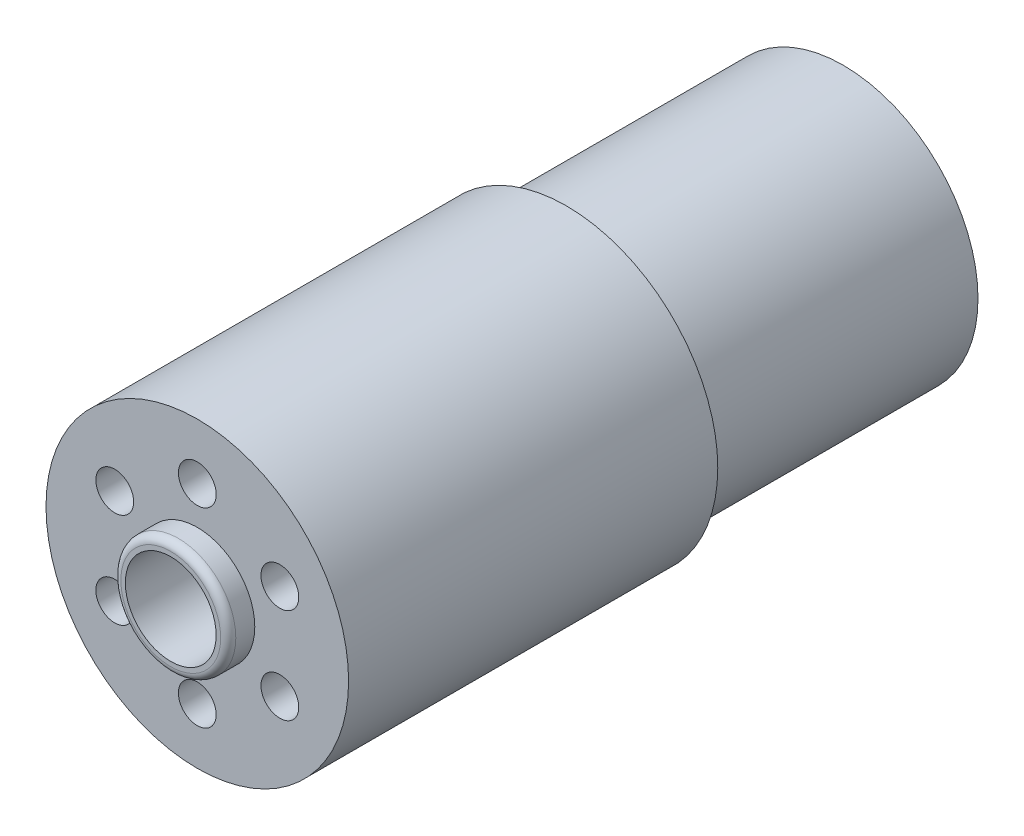
ISO-10303-21;
HEADER;
FILE_DESCRIPTION(('STEP AP214'),'2;1');
FILE_NAME('part.step','',(''),(''),'','','');
FILE_SCHEMA(('AUTOMOTIVE_DESIGN { 1 0 10303 214 1 1 1 1 }'));
ENDSEC;
DATA;
#1=APPLICATION_CONTEXT('core data for automotive mechanical design processes');
#2=APPLICATION_PROTOCOL_DEFINITION('international standard','automotive_design',2000,#1);
#3=PRODUCT_CONTEXT('',#1,'mechanical');
#4=PRODUCT('Part','Part','',(#3));
#5=PRODUCT_RELATED_PRODUCT_CATEGORY('part','',(#4));
#6=PRODUCT_DEFINITION_FORMATION('','',#4);
#7=PRODUCT_DEFINITION_CONTEXT('part definition',#1,'design');
#8=PRODUCT_DEFINITION('design','',#6,#7);
#9=PRODUCT_DEFINITION_SHAPE('','',#8);
#10=(LENGTH_UNIT() NAMED_UNIT(*) SI_UNIT(.MILLI.,.METRE.));
#11=(NAMED_UNIT(*) PLANE_ANGLE_UNIT() SI_UNIT($,.RADIAN.));
#12=(NAMED_UNIT(*) SI_UNIT($,.STERADIAN.) SOLID_ANGLE_UNIT());
#13=UNCERTAINTY_MEASURE_WITH_UNIT(LENGTH_MEASURE(1.E-05),#10,'distance_accuracy_value','');
#14=(GEOMETRIC_REPRESENTATION_CONTEXT(3) GLOBAL_UNCERTAINTY_ASSIGNED_CONTEXT((#13)) GLOBAL_UNIT_ASSIGNED_CONTEXT((#10,
#11,#12)) REPRESENTATION_CONTEXT('',''));
#15=CARTESIAN_POINT('',(0.,0.,0.));
#16=DIRECTION('',(0.,0.,1.));
#17=DIRECTION('',(1.,0.,0.));
#18=AXIS2_PLACEMENT_3D('',#15,#16,#17);
#19=CARTESIAN_POINT('',(0.,0.,0.));
#20=DIRECTION('',(0.,0.,1.));
#21=DIRECTION('',(1.,0.,0.));
#22=AXIS2_PLACEMENT_3D('',#19,#20,#21);
#23=PLANE('',#22);
#24=CARTESIAN_POINT('',(0.,0.,0.));
#25=DIRECTION('',(0.,0.,-1.));
#26=DIRECTION('',(-1.,0.,0.));
#27=AXIS2_PLACEMENT_3D('',#24,#25,#26);
#28=CIRCLE('',#27,22.606);
#29=CARTESIAN_POINT('',(-22.606,0.,0.));
#30=VERTEX_POINT('',#29);
#31=EDGE_CURVE('E128',#30,#30,#28,.T.);
#32=ORIENTED_EDGE('',*,*,#31,.T.);
#33=EDGE_LOOP('',(#32));
#34=FACE_BOUND('',#33,.T.);
#35=CARTESIAN_POINT('',(13.8581385113308,8.00100000004812,0.));
#36=DIRECTION('',(0.,0.,-1.));
#37=DIRECTION('',(-1.,0.,0.));
#38=AXIS2_PLACEMENT_3D('',#35,#36,#37);
#39=CIRCLE('',#38,3.175);
#40=CARTESIAN_POINT('',(10.6831385113308,8.00100000004812,0.));
#41=VERTEX_POINT('',#40);
#42=EDGE_CURVE('E75',#41,#41,#39,.T.);
#43=ORIENTED_EDGE('',*,*,#42,.F.);
#44=EDGE_LOOP('',(#43));
#45=FACE_BOUND('',#44,.T.);
#46=CARTESIAN_POINT('',(-5.55527845946813E-11,16.002,0.));
#47=DIRECTION('',(0.,0.,-1.));
#48=DIRECTION('',(-1.,0.,0.));
#49=AXIS2_PLACEMENT_3D('',#46,#47,#48);
#50=CIRCLE('',#49,3.175);
#51=CARTESIAN_POINT('',(-3.17500000005555,16.002,0.));
#52=VERTEX_POINT('',#51);
#53=EDGE_CURVE('E97',#52,#52,#50,.T.);
#54=ORIENTED_EDGE('',*,*,#53,.F.);
#55=EDGE_LOOP('',(#54));
#56=FACE_BOUND('',#55,.T.);
#57=CARTESIAN_POINT('',(-13.8581385113864,8.00099999995189,0.));
#58=DIRECTION('',(0.,0.,-1.));
#59=DIRECTION('',(-1.,0.,0.));
#60=AXIS2_PLACEMENT_3D('',#57,#58,#59);
#61=CIRCLE('',#60,3.175);
#62=CARTESIAN_POINT('',(-17.0331385113864,8.00099999995189,0.));
#63=VERTEX_POINT('',#62);
#64=EDGE_CURVE('E89',#63,#63,#61,.T.);
#65=ORIENTED_EDGE('',*,*,#64,.F.);
#66=EDGE_LOOP('',(#65));
#67=FACE_BOUND('',#66,.T.);
#68=CARTESIAN_POINT('',(-13.8581385113308,-8.00100000004812,0.));
#69=DIRECTION('',(0.,0.,-1.));
#70=DIRECTION('',(-1.,0.,0.));
#71=AXIS2_PLACEMENT_3D('',#68,#69,#70);
#72=CIRCLE('',#71,3.175);
#73=CARTESIAN_POINT('',(-17.0331385113308,-8.00100000004812,0.));
#74=VERTEX_POINT('',#73);
#75=EDGE_CURVE('E80',#74,#74,#72,.T.);
#76=ORIENTED_EDGE('',*,*,#75,.F.);
#77=EDGE_LOOP('',(#76));
#78=FACE_BOUND('',#77,.T.);
#79=CARTESIAN_POINT('',(5.55493151477293E-11,-16.002,0.));
#80=DIRECTION('',(0.,0.,-1.));
#81=DIRECTION('',(-1.,0.,0.));
#82=AXIS2_PLACEMENT_3D('',#79,#80,#81);
#83=CIRCLE('',#82,3.175);
#84=CARTESIAN_POINT('',(-3.17499999994445,-16.002,0.));
#85=VERTEX_POINT('',#84);
#86=EDGE_CURVE('E81',#85,#85,#83,.T.);
#87=ORIENTED_EDGE('',*,*,#86,.F.);
#88=EDGE_LOOP('',(#87));
#89=FACE_BOUND('',#88,.T.);
#90=CARTESIAN_POINT('',(13.8581385113864,-8.0009999999519,0.));
#91=DIRECTION('',(0.,0.,-1.));
#92=DIRECTION('',(-1.,0.,0.));
#93=AXIS2_PLACEMENT_3D('',#90,#91,#92);
#94=CIRCLE('',#93,3.175);
#95=CARTESIAN_POINT('',(10.6831385113864,-8.0009999999519,0.));
#96=VERTEX_POINT('',#95);
#97=EDGE_CURVE('E112',#96,#96,#94,.T.);
#98=ORIENTED_EDGE('',*,*,#97,.F.);
#99=EDGE_LOOP('',(#98));
#100=FACE_BOUND('',#99,.T.);
#101=CARTESIAN_POINT('',(0.,0.,0.));
#102=DIRECTION('',(0.,0.,1.));
#103=DIRECTION('',(1.,0.,0.));
#104=AXIS2_PLACEMENT_3D('',#101,#102,#103);
#105=CIRCLE('',#104,9.652);
#106=CARTESIAN_POINT('',(9.652,0.,0.));
#107=VERTEX_POINT('',#106);
#108=EDGE_CURVE('E67',#107,#107,#105,.F.);
#109=ORIENTED_EDGE('',*,*,#108,.F.);
#110=EDGE_LOOP('',(#109));
#111=FACE_BOUND('',#110,.T.);
#112=ADVANCED_FACE('F43',(#34,#45,#56,#67,#78,#89,#100,#111),#23,.F.);
#113=CARTESIAN_POINT('',(0.,0.,108.458));
#114=DIRECTION('',(0.,0.,1.));
#115=DIRECTION('',(1.,0.,0.));
#116=AXIS2_PLACEMENT_3D('',#113,#114,#115);
#117=PLANE('',#116);
#118=CARTESIAN_POINT('',(0.,0.,108.458));
#119=DIRECTION('',(0.,0.,1.));
#120=DIRECTION('',(1.,0.,0.));
#121=AXIS2_PLACEMENT_3D('',#118,#119,#120);
#122=CIRCLE('',#121,25.4);
#123=CARTESIAN_POINT('',(25.4,0.,108.458));
#124=VERTEX_POINT('',#123);
#125=EDGE_CURVE('E71',#124,#124,#122,.T.);
#126=ORIENTED_EDGE('',*,*,#125,.T.);
#127=EDGE_LOOP('',(#126));
#128=FACE_BOUND('',#127,.T.);
#129=CARTESIAN_POINT('',(13.8581385113864,-8.0009999999519,108.458));
#130=DIRECTION('',(0.,0.,-1.));
#131=DIRECTION('',(-1.,0.,0.));
#132=AXIS2_PLACEMENT_3D('',#129,#130,#131);
#133=CIRCLE('',#132,3.175);
#134=CARTESIAN_POINT('',(10.6831385113864,-8.0009999999519,108.458));
#135=VERTEX_POINT('',#134);
#136=EDGE_CURVE('E108',#135,#135,#133,.T.);
#137=ORIENTED_EDGE('',*,*,#136,.T.);
#138=EDGE_LOOP('',(#137));
#139=FACE_BOUND('',#138,.T.);
#140=CARTESIAN_POINT('',(5.55493151477293E-11,-16.002,108.458));
#141=DIRECTION('',(0.,0.,-1.));
#142=DIRECTION('',(-1.,0.,0.));
#143=AXIS2_PLACEMENT_3D('',#140,#141,#142);
#144=CIRCLE('',#143,3.175);
#145=CARTESIAN_POINT('',(-3.17499999994445,-16.002,108.458));
#146=VERTEX_POINT('',#145);
#147=EDGE_CURVE('E117',#146,#146,#144,.T.);
#148=ORIENTED_EDGE('',*,*,#147,.T.);
#149=EDGE_LOOP('',(#148));
#150=FACE_BOUND('',#149,.T.);
#151=CARTESIAN_POINT('',(-13.8581385113308,-8.00100000004812,108.458));
#152=DIRECTION('',(0.,0.,-1.));
#153=DIRECTION('',(-1.,0.,0.));
#154=AXIS2_PLACEMENT_3D('',#151,#152,#153);
#155=CIRCLE('',#154,3.175);
#156=CARTESIAN_POINT('',(-17.0331385113308,-8.00100000004812,108.458));
#157=VERTEX_POINT('',#156);
#158=EDGE_CURVE('E76',#157,#157,#155,.T.);
#159=ORIENTED_EDGE('',*,*,#158,.T.);
#160=EDGE_LOOP('',(#159));
#161=FACE_BOUND('',#160,.T.);
#162=CARTESIAN_POINT('',(-13.8581385113864,8.00099999995189,108.458));
#163=DIRECTION('',(0.,0.,-1.));
#164=DIRECTION('',(-1.,0.,0.));
#165=AXIS2_PLACEMENT_3D('',#162,#163,#164);
#166=CIRCLE('',#165,3.175);
#167=CARTESIAN_POINT('',(-17.0331385113864,8.00099999995189,108.458));
#168=VERTEX_POINT('',#167);
#169=EDGE_CURVE('E85',#168,#168,#166,.T.);
#170=ORIENTED_EDGE('',*,*,#169,.T.);
#171=EDGE_LOOP('',(#170));
#172=FACE_BOUND('',#171,.T.);
#173=CARTESIAN_POINT('',(-5.55527845946813E-11,16.002,108.458));
#174=DIRECTION('',(0.,0.,-1.));
#175=DIRECTION('',(-1.,0.,0.));
#176=AXIS2_PLACEMENT_3D('',#173,#174,#175);
#177=CIRCLE('',#176,3.175);
#178=CARTESIAN_POINT('',(-3.17500000005555,16.002,108.458));
#179=VERTEX_POINT('',#178);
#180=EDGE_CURVE('E93',#179,#179,#177,.T.);
#181=ORIENTED_EDGE('',*,*,#180,.T.);
#182=EDGE_LOOP('',(#181));
#183=FACE_BOUND('',#182,.T.);
#184=CARTESIAN_POINT('',(13.8581385113308,8.00100000004812,108.458));
#185=DIRECTION('',(0.,0.,-1.));
#186=DIRECTION('',(-1.,0.,0.));
#187=AXIS2_PLACEMENT_3D('',#184,#185,#186);
#188=CIRCLE('',#187,3.175);
#189=CARTESIAN_POINT('',(10.6831385113308,8.00100000004812,108.458));
#190=VERTEX_POINT('',#189);
#191=EDGE_CURVE('E101',#190,#190,#188,.T.);
#192=ORIENTED_EDGE('',*,*,#191,.T.);
#193=EDGE_LOOP('',(#192));
#194=FACE_BOUND('',#193,.T.);
#195=CARTESIAN_POINT('',(0.,0.,108.458));
#196=DIRECTION('',(0.,0.,1.));
#197=DIRECTION('',(1.,0.,0.));
#198=AXIS2_PLACEMENT_3D('',#195,#196,#197);
#199=CIRCLE('',#198,9.652);
#200=CARTESIAN_POINT('',(9.652,0.,108.458));
#201=VERTEX_POINT('',#200);
#202=EDGE_CURVE('E132',#201,#201,#199,.T.);
#203=ORIENTED_EDGE('',*,*,#202,.F.);
#204=EDGE_LOOP('',(#203));
#205=FACE_BOUND('',#204,.T.);
#206=ADVANCED_FACE('F165',(#128,#139,#150,#161,#172,#183,#194,#205),#117,.T.);
#207=CARTESIAN_POINT('',(0.,0.,108.458));
#208=DIRECTION('',(0.,0.,-1.));
#209=DIRECTION('',(-1.,0.,0.));
#210=AXIS2_PLACEMENT_3D('',#207,#208,#209);
#211=CYLINDRICAL_SURFACE('',#210,25.4);
#212=ORIENTED_EDGE('',*,*,#125,.F.);
#213=EDGE_LOOP('',(#212));
#214=FACE_BOUND('',#213,.T.);
#215=CARTESIAN_POINT('',(0.,0.,46.482));
#216=DIRECTION('',(0.,0.,-1.));
#217=DIRECTION('',(-1.,0.,0.));
#218=AXIS2_PLACEMENT_3D('',#215,#216,#217);
#219=CIRCLE('',#218,25.4);
#220=CARTESIAN_POINT('',(-25.4,0.,46.482));
#221=VERTEX_POINT('',#220);
#222=EDGE_CURVE('E113',#221,#221,#219,.T.);
#223=ORIENTED_EDGE('',*,*,#222,.F.);
#224=EDGE_LOOP('',(#223));
#225=FACE_BOUND('',#224,.T.);
#226=ADVANCED_FACE('F172',(#214,#225),#211,.T.);
#227=CARTESIAN_POINT('',(0.,0.,108.458));
#228=DIRECTION('',(0.,0.,-1.));
#229=DIRECTION('',(-1.,0.,0.));
#230=AXIS2_PLACEMENT_3D('',#227,#228,#229);
#231=CYLINDRICAL_SURFACE('',#230,7.62);
#232=CARTESIAN_POINT('',(0.,0.,112.9157));
#233=DIRECTION('',(0.,0.,1.));
#234=DIRECTION('',(1.,0.,0.));
#235=AXIS2_PLACEMENT_3D('',#232,#233,#234);
#236=CIRCLE('',#235,7.62);
#237=CARTESIAN_POINT('',(7.62,0.,112.9157));
#238=VERTEX_POINT('',#237);
#239=EDGE_CURVE('E139',#238,#238,#236,.T.);
#240=ORIENTED_EDGE('',*,*,#239,.T.);
#241=EDGE_LOOP('',(#240));
#242=FACE_BOUND('',#241,.T.);
#243=CARTESIAN_POINT('',(0.,0.,-4.4577));
#244=DIRECTION('',(0.,0.,-1.));
#245=DIRECTION('',(-1.,0.,0.));
#246=AXIS2_PLACEMENT_3D('',#243,#244,#245);
#247=CIRCLE('',#246,7.62);
#248=CARTESIAN_POINT('',(-7.62,0.,-4.4577));
#249=VERTEX_POINT('',#248);
#250=EDGE_CURVE('E143',#249,#249,#247,.T.);
#251=ORIENTED_EDGE('',*,*,#250,.T.);
#252=EDGE_LOOP('',(#251));
#253=FACE_BOUND('',#252,.T.);
#254=ADVANCED_FACE('F148',(#242,#253),#231,.F.);
#255=CARTESIAN_POINT('',(13.8581385113864,-8.0009999999519,108.458));
#256=DIRECTION('',(0.,0.,-1.));
#257=DIRECTION('',(-1.,0.,0.));
#258=AXIS2_PLACEMENT_3D('',#255,#256,#257);
#259=CYLINDRICAL_SURFACE('',#258,3.175);
#260=ORIENTED_EDGE('',*,*,#136,.F.);
#261=EDGE_LOOP('',(#260));
#262=FACE_BOUND('',#261,.T.);
#263=ORIENTED_EDGE('',*,*,#97,.T.);
#264=EDGE_LOOP('',(#263));
#265=FACE_BOUND('',#264,.T.);
#266=ADVANCED_FACE('F196',(#262,#265),#259,.F.);
#267=CARTESIAN_POINT('',(5.55493151477293E-11,-16.002,108.458));
#268=DIRECTION('',(0.,0.,-1.));
#269=DIRECTION('',(-1.,0.,0.));
#270=AXIS2_PLACEMENT_3D('',#267,#268,#269);
#271=CYLINDRICAL_SURFACE('',#270,3.175);
#272=ORIENTED_EDGE('',*,*,#147,.F.);
#273=EDGE_LOOP('',(#272));
#274=FACE_BOUND('',#273,.T.);
#275=ORIENTED_EDGE('',*,*,#86,.T.);
#276=EDGE_LOOP('',(#275));
#277=FACE_BOUND('',#276,.T.);
#278=ADVANCED_FACE('F200',(#274,#277),#271,.F.);
#279=CARTESIAN_POINT('',(-13.8581385113308,-8.00100000004812,108.458));
#280=DIRECTION('',(0.,0.,-1.));
#281=DIRECTION('',(-1.,0.,0.));
#282=AXIS2_PLACEMENT_3D('',#279,#280,#281);
#283=CYLINDRICAL_SURFACE('',#282,3.175);
#284=ORIENTED_EDGE('',*,*,#158,.F.);
#285=EDGE_LOOP('',(#284));
#286=FACE_BOUND('',#285,.T.);
#287=ORIENTED_EDGE('',*,*,#75,.T.);
#288=EDGE_LOOP('',(#287));
#289=FACE_BOUND('',#288,.T.);
#290=ADVANCED_FACE('F204',(#286,#289),#283,.F.);
#291=CARTESIAN_POINT('',(-13.8581385113864,8.00099999995189,108.458));
#292=DIRECTION('',(0.,0.,-1.));
#293=DIRECTION('',(-1.,0.,0.));
#294=AXIS2_PLACEMENT_3D('',#291,#292,#293);
#295=CYLINDRICAL_SURFACE('',#294,3.175);
#296=ORIENTED_EDGE('',*,*,#169,.F.);
#297=EDGE_LOOP('',(#296));
#298=FACE_BOUND('',#297,.T.);
#299=ORIENTED_EDGE('',*,*,#64,.T.);
#300=EDGE_LOOP('',(#299));
#301=FACE_BOUND('',#300,.T.);
#302=ADVANCED_FACE('F207',(#298,#301),#295,.F.);
#303=CARTESIAN_POINT('',(-5.55527845946813E-11,16.002,108.458));
#304=DIRECTION('',(0.,0.,-1.));
#305=DIRECTION('',(-1.,0.,0.));
#306=AXIS2_PLACEMENT_3D('',#303,#304,#305);
#307=CYLINDRICAL_SURFACE('',#306,3.175);
#308=ORIENTED_EDGE('',*,*,#180,.F.);
#309=EDGE_LOOP('',(#308));
#310=FACE_BOUND('',#309,.T.);
#311=ORIENTED_EDGE('',*,*,#53,.T.);
#312=EDGE_LOOP('',(#311));
#313=FACE_BOUND('',#312,.T.);
#314=ADVANCED_FACE('F211',(#310,#313),#307,.F.);
#315=CARTESIAN_POINT('',(13.8581385113308,8.00100000004812,108.458));
#316=DIRECTION('',(0.,0.,-1.));
#317=DIRECTION('',(-1.,0.,0.));
#318=AXIS2_PLACEMENT_3D('',#315,#316,#317);
#319=CYLINDRICAL_SURFACE('',#318,3.175);
#320=ORIENTED_EDGE('',*,*,#191,.F.);
#321=EDGE_LOOP('',(#320));
#322=FACE_BOUND('',#321,.T.);
#323=ORIENTED_EDGE('',*,*,#42,.T.);
#324=EDGE_LOOP('',(#323));
#325=FACE_BOUND('',#324,.T.);
#326=ADVANCED_FACE('F215',(#322,#325),#319,.F.);
#327=CARTESIAN_POINT('',(0.,0.,46.482));
#328=DIRECTION('',(0.,0.,-1.));
#329=DIRECTION('',(-1.,0.,0.));
#330=AXIS2_PLACEMENT_3D('',#327,#328,#329);
#331=PLANE('',#330);
#332=CARTESIAN_POINT('',(0.,0.,46.482));
#333=DIRECTION('',(0.,0.,-1.));
#334=DIRECTION('',(-1.,0.,0.));
#335=AXIS2_PLACEMENT_3D('',#332,#333,#334);
#336=CIRCLE('',#335,22.606);
#337=CARTESIAN_POINT('',(-22.606,0.,46.482));
#338=VERTEX_POINT('',#337);
#339=EDGE_CURVE('E127',#338,#338,#336,.T.);
#340=ORIENTED_EDGE('',*,*,#339,.F.);
#341=EDGE_LOOP('',(#340));
#342=FACE_BOUND('',#341,.T.);
#343=ORIENTED_EDGE('',*,*,#222,.T.);
#344=EDGE_LOOP('',(#343));
#345=FACE_BOUND('',#344,.T.);
#346=ADVANCED_FACE('F218',(#342,#345),#331,.T.);
#347=CARTESIAN_POINT('',(0.,0.,46.482));
#348=DIRECTION('',(0.,0.,-1.));
#349=DIRECTION('',(-1.,0.,0.));
#350=AXIS2_PLACEMENT_3D('',#347,#348,#349);
#351=CYLINDRICAL_SURFACE('',#350,22.606);
#352=ORIENTED_EDGE('',*,*,#339,.T.);
#353=EDGE_LOOP('',(#352));
#354=FACE_BOUND('',#353,.T.);
#355=ORIENTED_EDGE('',*,*,#31,.F.);
#356=EDGE_LOOP('',(#355));
#357=FACE_BOUND('',#356,.T.);
#358=ADVANCED_FACE('F192',(#354,#357),#351,.T.);
#359=CARTESIAN_POINT('',(0.,0.,112.9157));
#360=DIRECTION('',(0.,0.,1.));
#361=DIRECTION('',(1.,0.,0.));
#362=AXIS2_PLACEMENT_3D('',#359,#360,#361);
#363=PLANE('',#362);
#364=CARTESIAN_POINT('',(0.,0.,112.9157));
#365=DIRECTION('',(0.,0.,1.));
#366=DIRECTION('',(1.,0.,0.));
#367=AXIS2_PLACEMENT_3D('',#364,#365,#366);
#368=CIRCLE('',#367,8.382);
#369=CARTESIAN_POINT('',(8.382,0.,112.9157));
#370=VERTEX_POINT('',#369);
#371=EDGE_CURVE('E61',#370,#370,#368,.T.);
#372=ORIENTED_EDGE('',*,*,#371,.T.);
#373=EDGE_LOOP('',(#372));
#374=FACE_BOUND('',#373,.T.);
#375=ORIENTED_EDGE('',*,*,#239,.F.);
#376=EDGE_LOOP('',(#375));
#377=FACE_BOUND('',#376,.T.);
#378=ADVANCED_FACE('F161',(#374,#377),#363,.T.);
#379=CARTESIAN_POINT('',(0.,0.,112.9157));
#380=DIRECTION('',(0.,0.,-1.));
#381=DIRECTION('',(-1.,0.,0.));
#382=AXIS2_PLACEMENT_3D('',#379,#380,#381);
#383=CYLINDRICAL_SURFACE('',#382,9.652);
#384=CARTESIAN_POINT('',(0.,0.,111.6457));
#385=DIRECTION('',(0.,0.,1.));
#386=DIRECTION('',(1.,0.,0.));
#387=AXIS2_PLACEMENT_3D('',#384,#385,#386);
#388=CIRCLE('',#387,9.652);
#389=CARTESIAN_POINT('',(9.652,0.,111.6457));
#390=VERTEX_POINT('',#389);
#391=EDGE_CURVE('E56',#390,#390,#388,.F.);
#392=ORIENTED_EDGE('',*,*,#391,.T.);
#393=EDGE_LOOP('',(#392));
#394=FACE_BOUND('',#393,.T.);
#395=ORIENTED_EDGE('',*,*,#202,.T.);
#396=EDGE_LOOP('',(#395));
#397=FACE_BOUND('',#396,.T.);
#398=ADVANCED_FACE('F153',(#394,#397),#383,.T.);
#399=CARTESIAN_POINT('',(0.,0.,-4.4577));
#400=DIRECTION('',(0.,0.,-1.));
#401=DIRECTION('',(-1.,0.,0.));
#402=AXIS2_PLACEMENT_3D('',#399,#400,#401);
#403=PLANE('',#402);
#404=CARTESIAN_POINT('',(0.,0.,-4.4577));
#405=DIRECTION('',(0.,0.,-1.));
#406=DIRECTION('',(-1.,0.,0.));
#407=AXIS2_PLACEMENT_3D('',#404,#405,#406);
#408=CIRCLE('',#407,8.382);
#409=CARTESIAN_POINT('',(-8.382,0.,-4.4577));
#410=VERTEX_POINT('',#409);
#411=EDGE_CURVE('E51',#410,#410,#408,.T.);
#412=ORIENTED_EDGE('',*,*,#411,.T.);
#413=EDGE_LOOP('',(#412));
#414=FACE_BOUND('',#413,.T.);
#415=ORIENTED_EDGE('',*,*,#250,.F.);
#416=EDGE_LOOP('',(#415));
#417=FACE_BOUND('',#416,.T.);
#418=ADVANCED_FACE('F150',(#414,#417),#403,.T.);
#419=CARTESIAN_POINT('',(0.,0.,-4.4577));
#420=DIRECTION('',(0.,0.,1.));
#421=DIRECTION('',(1.,0.,0.));
#422=AXIS2_PLACEMENT_3D('',#419,#420,#421);
#423=CYLINDRICAL_SURFACE('',#422,9.652);
#424=CARTESIAN_POINT('',(0.,0.,-3.1877));
#425=DIRECTION('',(0.,0.,-1.));
#426=DIRECTION('',(-1.,0.,0.));
#427=AXIS2_PLACEMENT_3D('',#424,#425,#426);
#428=CIRCLE('',#427,9.652);
#429=CARTESIAN_POINT('',(-9.652,0.,-3.1877));
#430=VERTEX_POINT('',#429);
#431=EDGE_CURVE('E10',#430,#430,#428,.F.);
#432=ORIENTED_EDGE('',*,*,#431,.T.);
#433=EDGE_LOOP('',(#432));
#434=FACE_BOUND('',#433,.T.);
#435=ORIENTED_EDGE('',*,*,#108,.T.);
#436=EDGE_LOOP('',(#435));
#437=FACE_BOUND('',#436,.T.);
#438=ADVANCED_FACE('F152',(#434,#437),#423,.T.);
#439=CARTESIAN_POINT('',(0.,0.,111.6457));
#440=DIRECTION('',(0.,0.,1.));
#441=DIRECTION('',(1.,0.,0.));
#442=AXIS2_PLACEMENT_3D('',#439,#440,#441);
#443=TOROIDAL_SURFACE('',#442,8.382,1.27);
#444=ORIENTED_EDGE('',*,*,#391,.F.);
#445=EDGE_LOOP('',(#444));
#446=FACE_BOUND('',#445,.T.);
#447=ORIENTED_EDGE('',*,*,#371,.F.);
#448=EDGE_LOOP('',(#447));
#449=FACE_BOUND('',#448,.T.);
#450=ADVANCED_FACE('F159',(#446,#449),#443,.T.);
#451=CARTESIAN_POINT('',(0.,0.,-3.1877));
#452=DIRECTION('',(0.,0.,-1.));
#453=DIRECTION('',(-1.,0.,0.));
#454=AXIS2_PLACEMENT_3D('',#451,#452,#453);
#455=TOROIDAL_SURFACE('',#454,8.382,1.27);
#456=ORIENTED_EDGE('',*,*,#431,.F.);
#457=EDGE_LOOP('',(#456));
#458=FACE_BOUND('',#457,.T.);
#459=ORIENTED_EDGE('',*,*,#411,.F.);
#460=EDGE_LOOP('',(#459));
#461=FACE_BOUND('',#460,.T.);
#462=ADVANCED_FACE('F45',(#458,#461),#455,.T.);
#463=CLOSED_SHELL('',(#112,#206,#226,#254,#266,#278,#290,#302,#314,#326,#346,#358,#378,#398,
#418,#438,#450,#462));
#464=MANIFOLD_SOLID_BREP('B2',#463);
#465=ADVANCED_BREP_SHAPE_REPRESENTATION('',(#18,#464),#14);
#466=SHAPE_DEFINITION_REPRESENTATION(#9,#465);
ENDSEC;
END-ISO-10303-21;
